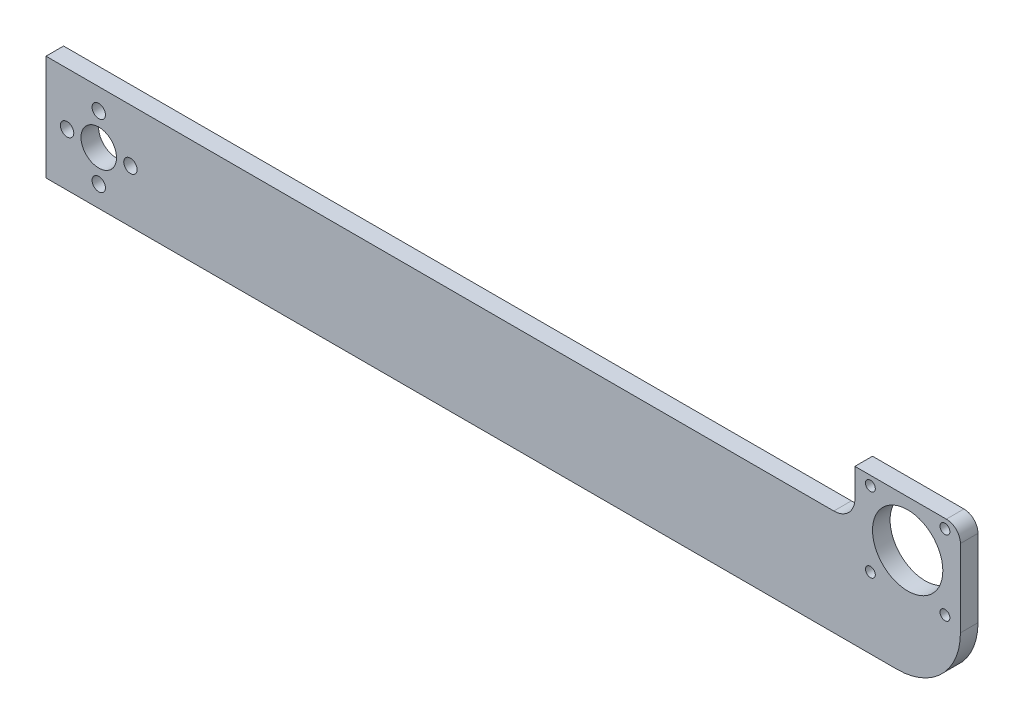
ISO-10303-21;
HEADER;
FILE_DESCRIPTION(('STEP AP214'),'2;1');
FILE_NAME('part.step','',(''),(''),'','','');
FILE_SCHEMA(('AUTOMOTIVE_DESIGN { 1 0 10303 214 1 1 1 1 }'));
ENDSEC;
DATA;
#1=APPLICATION_CONTEXT('core data for automotive mechanical design processes');
#2=APPLICATION_PROTOCOL_DEFINITION('international standard','automotive_design',2000,#1);
#3=PRODUCT_CONTEXT('',#1,'mechanical');
#4=PRODUCT('Part','Part','',(#3));
#5=PRODUCT_RELATED_PRODUCT_CATEGORY('part','',(#4));
#6=PRODUCT_DEFINITION_FORMATION('','',#4);
#7=PRODUCT_DEFINITION_CONTEXT('part definition',#1,'design');
#8=PRODUCT_DEFINITION('design','',#6,#7);
#9=PRODUCT_DEFINITION_SHAPE('','',#8);
#10=(LENGTH_UNIT() NAMED_UNIT(*) SI_UNIT(.MILLI.,.METRE.));
#11=(NAMED_UNIT(*) PLANE_ANGLE_UNIT() SI_UNIT($,.RADIAN.));
#12=(NAMED_UNIT(*) SI_UNIT($,.STERADIAN.) SOLID_ANGLE_UNIT());
#13=UNCERTAINTY_MEASURE_WITH_UNIT(LENGTH_MEASURE(1.E-05),#10,'distance_accuracy_value','');
#14=(GEOMETRIC_REPRESENTATION_CONTEXT(3) GLOBAL_UNCERTAINTY_ASSIGNED_CONTEXT((#13)) GLOBAL_UNIT_ASSIGNED_CONTEXT((#10,
#11,#12)) REPRESENTATION_CONTEXT('',''));
#15=CARTESIAN_POINT('',(0.,0.,0.));
#16=DIRECTION('',(0.,0.,1.));
#17=DIRECTION('',(1.,0.,0.));
#18=AXIS2_PLACEMENT_3D('',#15,#16,#17);
#19=CARTESIAN_POINT('',(288.29,3.81000000000001,6.35));
#20=DIRECTION('',(0.,0.,1.));
#21=DIRECTION('',(1.,0.,0.));
#22=AXIS2_PLACEMENT_3D('',#19,#20,#21);
#23=PLANE('',#22);
#24=CARTESIAN_POINT('',(305.562,6.58723685199558,6.35));
#25=DIRECTION('',(0.,0.,1.));
#26=DIRECTION('',(1.,0.,0.));
#27=AXIS2_PLACEMENT_3D('',#24,#25,#26);
#28=CIRCLE('',#27,1.77799999999998);
#29=CARTESIAN_POINT('',(307.34,6.58723685199558,6.35));
#30=VERTEX_POINT('',#29);
#31=EDGE_CURVE('E222',#30,#30,#28,.T.);
#32=ORIENTED_EDGE('',*,*,#31,.F.);
#33=EDGE_LOOP('',(#32));
#34=FACE_BOUND('',#33,.T.);
#35=CARTESIAN_POINT('',(278.638,33.5447631480043,6.35));
#36=DIRECTION('',(0.,0.,1.));
#37=DIRECTION('',(1.,0.,0.));
#38=AXIS2_PLACEMENT_3D('',#35,#36,#37);
#39=CIRCLE('',#38,1.77799999999998);
#40=CARTESIAN_POINT('',(280.416,33.5447631480043,6.35));
#41=VERTEX_POINT('',#40);
#42=EDGE_CURVE('E210',#41,#41,#39,.T.);
#43=ORIENTED_EDGE('',*,*,#42,.F.);
#44=EDGE_LOOP('',(#43));
#45=FACE_BOUND('',#44,.T.);
#46=CARTESIAN_POINT('',(-11.4299999999997,-3.24160253143805E-13,6.35));
#47=DIRECTION('',(0.,0.,1.));
#48=DIRECTION('',(1.,0.,0.));
#49=AXIS2_PLACEMENT_3D('',#46,#47,#48);
#50=CIRCLE('',#49,2.413);
#51=CARTESIAN_POINT('',(-9.01699999999968,-3.24160253143805E-13,6.35));
#52=VERTEX_POINT('',#51);
#53=EDGE_CURVE('E198',#52,#52,#50,.T.);
#54=ORIENTED_EDGE('',*,*,#53,.F.);
#55=EDGE_LOOP('',(#54));
#56=FACE_BOUND('',#55,.T.);
#57=CARTESIAN_POINT('',(11.4300000000003,3.2276048185238E-13,6.35));
#58=DIRECTION('',(0.,0.,1.));
#59=DIRECTION('',(1.,0.,0.));
#60=AXIS2_PLACEMENT_3D('',#57,#58,#59);
#61=CIRCLE('',#60,2.413);
#62=CARTESIAN_POINT('',(13.8430000000003,3.2276048185238E-13,6.35));
#63=VERTEX_POINT('',#62);
#64=EDGE_CURVE('E186',#63,#63,#61,.T.);
#65=ORIENTED_EDGE('',*,*,#64,.F.);
#66=EDGE_LOOP('',(#65));
#67=FACE_BOUND('',#66,.T.);
#68=CARTESIAN_POINT('',(0.,0.,6.35));
#69=DIRECTION('',(0.,0.,1.));
#70=DIRECTION('',(1.,0.,0.));
#71=AXIS2_PLACEMENT_3D('',#68,#69,#70);
#72=CIRCLE('',#71,6.4135);
#73=CARTESIAN_POINT('',(6.4135,0.,6.35));
#74=VERTEX_POINT('',#73);
#75=EDGE_CURVE('E166',#74,#74,#72,.T.);
#76=ORIENTED_EDGE('',*,*,#75,.F.);
#77=EDGE_LOOP('',(#76));
#78=FACE_BOUND('',#77,.T.);
#79=DIRECTION('',(0.,1.,0.));
#80=VECTOR('',#79,1.);
#81=CARTESIAN_POINT('',(311.15,3.81000000000001,6.35));
#82=LINE('',#81,#80);
#83=CARTESIAN_POINT('',(311.15,3.81000000000001,6.35));
#84=VERTEX_POINT('',#83);
#85=CARTESIAN_POINT('',(311.15,31.75,6.35));
#86=VERTEX_POINT('',#85);
#87=EDGE_CURVE('E174',#84,#86,#82,.T.);
#88=ORIENTED_EDGE('',*,*,#87,.T.);
#89=CARTESIAN_POINT('',(306.07,31.75,6.35));
#90=DIRECTION('',(0.,0.,1.));
#91=DIRECTION('',(1.,0.,0.));
#92=AXIS2_PLACEMENT_3D('',#89,#90,#91);
#93=CIRCLE('',#92,5.08);
#94=CARTESIAN_POINT('',(306.07,36.83,6.35));
#95=VERTEX_POINT('',#94);
#96=EDGE_CURVE('E11',#86,#95,#93,.T.);
#97=ORIENTED_EDGE('',*,*,#96,.T.);
#98=DIRECTION('',(-1.,0.,0.));
#99=VECTOR('',#98,1.);
#100=CARTESIAN_POINT('',(273.05,36.83,6.35));
#101=LINE('',#100,#99);
#102=CARTESIAN_POINT('',(273.05,36.83,6.35));
#103=VERTEX_POINT('',#102);
#104=EDGE_CURVE('E172',#95,#103,#101,.T.);
#105=ORIENTED_EDGE('',*,*,#104,.T.);
#106=DIRECTION('',(0.,-1.,0.));
#107=VECTOR('',#106,1.);
#108=CARTESIAN_POINT('',(273.05,36.83,6.35));
#109=LINE('',#108,#107);
#110=CARTESIAN_POINT('',(273.05,26.67,6.35));
#111=VERTEX_POINT('',#110);
#112=EDGE_CURVE('E170',#103,#111,#109,.T.);
#113=ORIENTED_EDGE('',*,*,#112,.T.);
#114=CARTESIAN_POINT('',(265.43,26.67,6.35));
#115=DIRECTION('',(0.,0.,-1.));
#116=DIRECTION('',(1.,0.,0.));
#117=AXIS2_PLACEMENT_3D('',#114,#115,#116);
#118=CIRCLE('',#117,7.62000000000001);
#119=CARTESIAN_POINT('',(265.43,19.05,6.35));
#120=VERTEX_POINT('',#119);
#121=EDGE_CURVE('E168',#111,#120,#118,.T.);
#122=ORIENTED_EDGE('',*,*,#121,.T.);
#123=DIRECTION('',(-1.,0.,0.));
#124=VECTOR('',#123,1.);
#125=CARTESIAN_POINT('',(-19.05,19.05,6.35));
#126=LINE('',#125,#124);
#127=CARTESIAN_POINT('',(-19.05,19.05,6.35));
#128=VERTEX_POINT('',#127);
#129=EDGE_CURVE('E122',#120,#128,#126,.T.);
#130=ORIENTED_EDGE('',*,*,#129,.T.);
#131=DIRECTION('',(0.,-1.,0.));
#132=VECTOR('',#131,1.);
#133=CARTESIAN_POINT('',(-19.05,19.05,6.35));
#134=LINE('',#133,#132);
#135=CARTESIAN_POINT('',(-19.05,-19.05,6.35));
#136=VERTEX_POINT('',#135);
#137=EDGE_CURVE('E117',#128,#136,#134,.T.);
#138=ORIENTED_EDGE('',*,*,#137,.T.);
#139=DIRECTION('',(1.,0.,0.));
#140=VECTOR('',#139,1.);
#141=CARTESIAN_POINT('',(-19.05,-19.05,6.35));
#142=LINE('',#141,#140);
#143=CARTESIAN_POINT('',(288.29,-19.05,6.35));
#144=VERTEX_POINT('',#143);
#145=EDGE_CURVE('E106',#136,#144,#142,.T.);
#146=ORIENTED_EDGE('',*,*,#145,.T.);
#147=CARTESIAN_POINT('',(288.29,3.81000000000001,6.35));
#148=DIRECTION('',(0.,0.,1.));
#149=DIRECTION('',(1.,0.,0.));
#150=AXIS2_PLACEMENT_3D('',#147,#148,#149);
#151=CIRCLE('',#150,22.86);
#152=EDGE_CURVE('E116',#144,#84,#151,.T.);
#153=ORIENTED_EDGE('',*,*,#152,.T.);
#154=EDGE_LOOP('',(#88,#97,#105,#113,#122,#130,#138,#146,#153));
#155=FACE_BOUND('',#154,.T.);
#156=CARTESIAN_POINT('',(0.,11.43,6.35));
#157=DIRECTION('',(0.,0.,1.));
#158=DIRECTION('',(1.,0.,0.));
#159=AXIS2_PLACEMENT_3D('',#156,#157,#158);
#160=CIRCLE('',#159,2.413);
#161=CARTESIAN_POINT('',(2.413,11.43,6.35));
#162=VERTEX_POINT('',#161);
#163=EDGE_CURVE('E180',#162,#162,#160,.T.);
#164=ORIENTED_EDGE('',*,*,#163,.F.);
#165=EDGE_LOOP('',(#164));
#166=FACE_BOUND('',#165,.T.);
#167=CARTESIAN_POINT('',(6.45520963704759E-13,-11.43,6.35));
#168=DIRECTION('',(0.,0.,1.));
#169=DIRECTION('',(1.,0.,0.));
#170=AXIS2_PLACEMENT_3D('',#167,#168,#169);
#171=CIRCLE('',#170,2.413);
#172=CARTESIAN_POINT('',(2.41300000000065,-11.43,6.35));
#173=VERTEX_POINT('',#172);
#174=EDGE_CURVE('E192',#173,#173,#171,.T.);
#175=ORIENTED_EDGE('',*,*,#174,.F.);
#176=EDGE_LOOP('',(#175));
#177=FACE_BOUND('',#176,.T.);
#178=CARTESIAN_POINT('',(292.1,20.066,6.35));
#179=DIRECTION('',(0.,0.,1.));
#180=DIRECTION('',(1.,0.,0.));
#181=AXIS2_PLACEMENT_3D('',#178,#179,#180);
#182=CIRCLE('',#181,12.7);
#183=CARTESIAN_POINT('',(304.8,20.066,6.35));
#184=VERTEX_POINT('',#183);
#185=EDGE_CURVE('E204',#184,#184,#182,.T.);
#186=ORIENTED_EDGE('',*,*,#185,.F.);
#187=EDGE_LOOP('',(#186));
#188=FACE_BOUND('',#187,.T.);
#189=CARTESIAN_POINT('',(305.562,33.5447631480043,6.35));
#190=DIRECTION('',(0.,0.,1.));
#191=DIRECTION('',(1.,0.,0.));
#192=AXIS2_PLACEMENT_3D('',#189,#190,#191);
#193=CIRCLE('',#192,1.77799999999998);
#194=CARTESIAN_POINT('',(307.34,33.5447631480043,6.35));
#195=VERTEX_POINT('',#194);
#196=EDGE_CURVE('E216',#195,#195,#193,.T.);
#197=ORIENTED_EDGE('',*,*,#196,.F.);
#198=EDGE_LOOP('',(#197));
#199=FACE_BOUND('',#198,.T.);
#200=CARTESIAN_POINT('',(278.638,6.58723685199558,6.35));
#201=DIRECTION('',(0.,0.,1.));
#202=DIRECTION('',(1.,0.,0.));
#203=AXIS2_PLACEMENT_3D('',#200,#201,#202);
#204=CIRCLE('',#203,1.77799999999998);
#205=CARTESIAN_POINT('',(280.416,6.58723685199558,6.35));
#206=VERTEX_POINT('',#205);
#207=EDGE_CURVE('E228',#206,#206,#204,.T.);
#208=ORIENTED_EDGE('',*,*,#207,.F.);
#209=EDGE_LOOP('',(#208));
#210=FACE_BOUND('',#209,.T.);
#211=ADVANCED_FACE('F35',(#34,#45,#56,#67,#78,#155,#166,#177,#188,#199,#210),#23,.T.);
#212=CARTESIAN_POINT('',(288.29,3.81000000000001,0.));
#213=DIRECTION('',(0.,0.,1.));
#214=DIRECTION('',(1.,0.,0.));
#215=AXIS2_PLACEMENT_3D('',#212,#213,#214);
#216=PLANE('',#215);
#217=DIRECTION('',(-1.,0.,0.));
#218=VECTOR('',#217,1.);
#219=CARTESIAN_POINT('',(273.05,36.83,0.));
#220=LINE('',#219,#218);
#221=CARTESIAN_POINT('',(306.07,36.83,0.));
#222=VERTEX_POINT('',#221);
#223=CARTESIAN_POINT('',(273.05,36.83,0.));
#224=VERTEX_POINT('',#223);
#225=EDGE_CURVE('E157',#222,#224,#220,.T.);
#226=ORIENTED_EDGE('',*,*,#225,.F.);
#227=CARTESIAN_POINT('',(306.07,31.75,0.));
#228=DIRECTION('',(0.,0.,1.));
#229=DIRECTION('',(1.,0.,0.));
#230=AXIS2_PLACEMENT_3D('',#227,#228,#229);
#231=CIRCLE('',#230,5.08);
#232=CARTESIAN_POINT('',(311.15,31.75,0.));
#233=VERTEX_POINT('',#232);
#234=EDGE_CURVE('E57',#222,#233,#231,.F.);
#235=ORIENTED_EDGE('',*,*,#234,.T.);
#236=DIRECTION('',(0.,1.,0.));
#237=VECTOR('',#236,1.);
#238=CARTESIAN_POINT('',(311.15,3.81000000000001,0.));
#239=LINE('',#238,#237);
#240=CARTESIAN_POINT('',(311.15,3.81000000000001,0.));
#241=VERTEX_POINT('',#240);
#242=EDGE_CURVE('E159',#241,#233,#239,.T.);
#243=ORIENTED_EDGE('',*,*,#242,.F.);
#244=CARTESIAN_POINT('',(288.29,3.81000000000001,0.));
#245=DIRECTION('',(0.,0.,1.));
#246=DIRECTION('',(1.,0.,0.));
#247=AXIS2_PLACEMENT_3D('',#244,#245,#246);
#248=CIRCLE('',#247,22.86);
#249=CARTESIAN_POINT('',(288.29,-19.05,0.));
#250=VERTEX_POINT('',#249);
#251=EDGE_CURVE('E161',#250,#241,#248,.T.);
#252=ORIENTED_EDGE('',*,*,#251,.F.);
#253=DIRECTION('',(1.,0.,0.));
#254=VECTOR('',#253,1.);
#255=CARTESIAN_POINT('',(286.189260549362,-19.05,0.));
#256=LINE('',#255,#254);
#257=CARTESIAN_POINT('',(-19.05,-19.05,0.));
#258=VERTEX_POINT('',#257);
#259=EDGE_CURVE('E163',#258,#250,#256,.T.);
#260=ORIENTED_EDGE('',*,*,#259,.F.);
#261=DIRECTION('',(0.,-1.,0.));
#262=VECTOR('',#261,1.);
#263=CARTESIAN_POINT('',(-19.05,19.05,0.));
#264=LINE('',#263,#262);
#265=CARTESIAN_POINT('',(-19.05,19.05,0.));
#266=VERTEX_POINT('',#265);
#267=EDGE_CURVE('E130',#266,#258,#264,.T.);
#268=ORIENTED_EDGE('',*,*,#267,.F.);
#269=DIRECTION('',(-1.,0.,0.));
#270=VECTOR('',#269,1.);
#271=CARTESIAN_POINT('',(-19.05,19.05,0.));
#272=LINE('',#271,#270);
#273=CARTESIAN_POINT('',(265.43,19.05,0.));
#274=VERTEX_POINT('',#273);
#275=EDGE_CURVE('E126',#274,#266,#272,.T.);
#276=ORIENTED_EDGE('',*,*,#275,.F.);
#277=CARTESIAN_POINT('',(265.43,26.67,0.));
#278=DIRECTION('',(0.,0.,-1.));
#279=DIRECTION('',(1.,0.,0.));
#280=AXIS2_PLACEMENT_3D('',#277,#278,#279);
#281=CIRCLE('',#280,7.62000000000001);
#282=CARTESIAN_POINT('',(273.05,26.67,0.));
#283=VERTEX_POINT('',#282);
#284=EDGE_CURVE('E153',#283,#274,#281,.T.);
#285=ORIENTED_EDGE('',*,*,#284,.F.);
#286=DIRECTION('',(0.,-1.,0.));
#287=VECTOR('',#286,1.);
#288=CARTESIAN_POINT('',(273.05,36.83,0.));
#289=LINE('',#288,#287);
#290=EDGE_CURVE('E155',#224,#283,#289,.T.);
#291=ORIENTED_EDGE('',*,*,#290,.F.);
#292=EDGE_LOOP('',(#226,#235,#243,#252,#260,#268,#276,#285,#291));
#293=FACE_BOUND('',#292,.T.);
#294=CARTESIAN_POINT('',(0.,0.,0.));
#295=DIRECTION('',(0.,0.,1.));
#296=DIRECTION('',(1.,0.,0.));
#297=AXIS2_PLACEMENT_3D('',#294,#295,#296);
#298=CIRCLE('',#297,6.4135);
#299=CARTESIAN_POINT('',(6.4135,0.,0.));
#300=VERTEX_POINT('',#299);
#301=EDGE_CURVE('E177',#300,#300,#298,.T.);
#302=ORIENTED_EDGE('',*,*,#301,.T.);
#303=EDGE_LOOP('',(#302));
#304=FACE_BOUND('',#303,.T.);
#305=CARTESIAN_POINT('',(0.,11.43,0.));
#306=DIRECTION('',(0.,0.,1.));
#307=DIRECTION('',(1.,0.,0.));
#308=AXIS2_PLACEMENT_3D('',#305,#306,#307);
#309=CIRCLE('',#308,2.413);
#310=CARTESIAN_POINT('',(2.413,11.43,0.));
#311=VERTEX_POINT('',#310);
#312=EDGE_CURVE('E183',#311,#311,#309,.T.);
#313=ORIENTED_EDGE('',*,*,#312,.T.);
#314=EDGE_LOOP('',(#313));
#315=FACE_BOUND('',#314,.T.);
#316=CARTESIAN_POINT('',(11.4300000000003,3.2276048185238E-13,0.));
#317=DIRECTION('',(0.,0.,1.));
#318=DIRECTION('',(1.,0.,0.));
#319=AXIS2_PLACEMENT_3D('',#316,#317,#318);
#320=CIRCLE('',#319,2.413);
#321=CARTESIAN_POINT('',(13.8430000000003,3.2276048185238E-13,0.));
#322=VERTEX_POINT('',#321);
#323=EDGE_CURVE('E189',#322,#322,#320,.T.);
#324=ORIENTED_EDGE('',*,*,#323,.T.);
#325=EDGE_LOOP('',(#324));
#326=FACE_BOUND('',#325,.T.);
#327=CARTESIAN_POINT('',(6.45520963704759E-13,-11.43,0.));
#328=DIRECTION('',(0.,0.,1.));
#329=DIRECTION('',(1.,0.,0.));
#330=AXIS2_PLACEMENT_3D('',#327,#328,#329);
#331=CIRCLE('',#330,2.413);
#332=CARTESIAN_POINT('',(2.41300000000065,-11.43,0.));
#333=VERTEX_POINT('',#332);
#334=EDGE_CURVE('E195',#333,#333,#331,.T.);
#335=ORIENTED_EDGE('',*,*,#334,.T.);
#336=EDGE_LOOP('',(#335));
#337=FACE_BOUND('',#336,.T.);
#338=CARTESIAN_POINT('',(-11.4299999999997,-3.24160253143805E-13,0.));
#339=DIRECTION('',(0.,0.,1.));
#340=DIRECTION('',(1.,0.,0.));
#341=AXIS2_PLACEMENT_3D('',#338,#339,#340);
#342=CIRCLE('',#341,2.413);
#343=CARTESIAN_POINT('',(-9.01699999999968,-3.24160253143805E-13,0.));
#344=VERTEX_POINT('',#343);
#345=EDGE_CURVE('E201',#344,#344,#342,.T.);
#346=ORIENTED_EDGE('',*,*,#345,.T.);
#347=EDGE_LOOP('',(#346));
#348=FACE_BOUND('',#347,.T.);
#349=CARTESIAN_POINT('',(292.1,20.066,0.));
#350=DIRECTION('',(0.,0.,1.));
#351=DIRECTION('',(1.,0.,0.));
#352=AXIS2_PLACEMENT_3D('',#349,#350,#351);
#353=CIRCLE('',#352,12.7);
#354=CARTESIAN_POINT('',(304.8,20.066,0.));
#355=VERTEX_POINT('',#354);
#356=EDGE_CURVE('E207',#355,#355,#353,.T.);
#357=ORIENTED_EDGE('',*,*,#356,.T.);
#358=EDGE_LOOP('',(#357));
#359=FACE_BOUND('',#358,.T.);
#360=CARTESIAN_POINT('',(278.638,33.5447631480043,0.));
#361=DIRECTION('',(0.,0.,1.));
#362=DIRECTION('',(1.,0.,0.));
#363=AXIS2_PLACEMENT_3D('',#360,#361,#362);
#364=CIRCLE('',#363,1.77799999999998);
#365=CARTESIAN_POINT('',(280.416,33.5447631480043,0.));
#366=VERTEX_POINT('',#365);
#367=EDGE_CURVE('E213',#366,#366,#364,.T.);
#368=ORIENTED_EDGE('',*,*,#367,.T.);
#369=EDGE_LOOP('',(#368));
#370=FACE_BOUND('',#369,.T.);
#371=CARTESIAN_POINT('',(305.562,33.5447631480043,0.));
#372=DIRECTION('',(0.,0.,1.));
#373=DIRECTION('',(1.,0.,0.));
#374=AXIS2_PLACEMENT_3D('',#371,#372,#373);
#375=CIRCLE('',#374,1.77799999999998);
#376=CARTESIAN_POINT('',(307.34,33.5447631480043,0.));
#377=VERTEX_POINT('',#376);
#378=EDGE_CURVE('E219',#377,#377,#375,.T.);
#379=ORIENTED_EDGE('',*,*,#378,.T.);
#380=EDGE_LOOP('',(#379));
#381=FACE_BOUND('',#380,.T.);
#382=CARTESIAN_POINT('',(305.562,6.58723685199558,0.));
#383=DIRECTION('',(0.,0.,1.));
#384=DIRECTION('',(1.,0.,0.));
#385=AXIS2_PLACEMENT_3D('',#382,#383,#384);
#386=CIRCLE('',#385,1.77799999999998);
#387=CARTESIAN_POINT('',(307.34,6.58723685199558,0.));
#388=VERTEX_POINT('',#387);
#389=EDGE_CURVE('E225',#388,#388,#386,.T.);
#390=ORIENTED_EDGE('',*,*,#389,.T.);
#391=EDGE_LOOP('',(#390));
#392=FACE_BOUND('',#391,.T.);
#393=CARTESIAN_POINT('',(278.638,6.58723685199558,0.));
#394=DIRECTION('',(0.,0.,1.));
#395=DIRECTION('',(1.,0.,0.));
#396=AXIS2_PLACEMENT_3D('',#393,#394,#395);
#397=CIRCLE('',#396,1.77799999999998);
#398=CARTESIAN_POINT('',(280.416,6.58723685199558,0.));
#399=VERTEX_POINT('',#398);
#400=EDGE_CURVE('E231',#399,#399,#397,.T.);
#401=ORIENTED_EDGE('',*,*,#400,.T.);
#402=EDGE_LOOP('',(#401));
#403=FACE_BOUND('',#402,.T.);
#404=ADVANCED_FACE('F241',(#293,#304,#315,#326,#337,#348,#359,#370,#381,#392,#403),#216,.F.);
#405=CARTESIAN_POINT('',(-19.05,19.05,6.35));
#406=DIRECTION('',(1.,0.,0.));
#407=DIRECTION('',(0.,0.,-1.));
#408=AXIS2_PLACEMENT_3D('',#405,#406,#407);
#409=PLANE('',#408);
#410=ORIENTED_EDGE('',*,*,#267,.T.);
#411=DIRECTION('',(0.,0.,-1.));
#412=VECTOR('',#411,1.);
#413=CARTESIAN_POINT('',(-19.05,-19.05,6.35));
#414=LINE('',#413,#412);
#415=EDGE_CURVE('E110',#136,#258,#414,.T.);
#416=ORIENTED_EDGE('',*,*,#415,.F.);
#417=ORIENTED_EDGE('',*,*,#137,.F.);
#418=DIRECTION('',(0.,0.,-1.));
#419=VECTOR('',#418,1.);
#420=CARTESIAN_POINT('',(-19.05,19.05,6.35));
#421=LINE('',#420,#419);
#422=EDGE_CURVE('E150',#128,#266,#421,.T.);
#423=ORIENTED_EDGE('',*,*,#422,.T.);
#424=EDGE_LOOP('',(#410,#416,#417,#423));
#425=FACE_BOUND('',#424,.T.);
#426=ADVANCED_FACE('F128',(#425),#409,.F.);
#427=CARTESIAN_POINT('',(286.189260549362,-19.05,6.35));
#428=DIRECTION('',(0.,1.,0.));
#429=DIRECTION('',(0.,0.,1.));
#430=AXIS2_PLACEMENT_3D('',#427,#428,#429);
#431=PLANE('',#430);
#432=ORIENTED_EDGE('',*,*,#259,.T.);
#433=DIRECTION('',(0.,0.,-1.));
#434=VECTOR('',#433,1.);
#435=CARTESIAN_POINT('',(288.29,-19.05,6.35));
#436=LINE('',#435,#434);
#437=EDGE_CURVE('E113',#144,#250,#436,.T.);
#438=ORIENTED_EDGE('',*,*,#437,.F.);
#439=ORIENTED_EDGE('',*,*,#145,.F.);
#440=ORIENTED_EDGE('',*,*,#415,.T.);
#441=EDGE_LOOP('',(#432,#438,#439,#440));
#442=FACE_BOUND('',#441,.T.);
#443=ADVANCED_FACE('F108',(#442),#431,.F.);
#444=CARTESIAN_POINT('',(288.29,3.81000000000001,6.35));
#445=DIRECTION('',(0.,0.,-1.));
#446=DIRECTION('',(-1.,0.,0.));
#447=AXIS2_PLACEMENT_3D('',#444,#445,#446);
#448=CYLINDRICAL_SURFACE('',#447,22.86);
#449=ORIENTED_EDGE('',*,*,#251,.T.);
#450=DIRECTION('',(0.,0.,-1.));
#451=VECTOR('',#450,1.);
#452=CARTESIAN_POINT('',(311.15,3.81000000000001,6.35));
#453=LINE('',#452,#451);
#454=EDGE_CURVE('E135',#84,#241,#453,.T.);
#455=ORIENTED_EDGE('',*,*,#454,.F.);
#456=ORIENTED_EDGE('',*,*,#152,.F.);
#457=ORIENTED_EDGE('',*,*,#437,.T.);
#458=EDGE_LOOP('',(#449,#455,#456,#457));
#459=FACE_BOUND('',#458,.T.);
#460=ADVANCED_FACE('F273',(#459),#448,.T.);
#461=CARTESIAN_POINT('',(311.15,3.81000000000001,6.35));
#462=DIRECTION('',(-1.,0.,0.));
#463=DIRECTION('',(0.,0.,1.));
#464=AXIS2_PLACEMENT_3D('',#461,#462,#463);
#465=PLANE('',#464);
#466=ORIENTED_EDGE('',*,*,#242,.T.);
#467=DIRECTION('',(0.,0.,-1.));
#468=VECTOR('',#467,1.);
#469=CARTESIAN_POINT('',(311.15,31.75,6.35));
#470=LINE('',#469,#468);
#471=EDGE_CURVE('E43',#233,#86,#470,.F.);
#472=ORIENTED_EDGE('',*,*,#471,.T.);
#473=ORIENTED_EDGE('',*,*,#87,.F.);
#474=ORIENTED_EDGE('',*,*,#454,.T.);
#475=EDGE_LOOP('',(#466,#472,#473,#474));
#476=FACE_BOUND('',#475,.T.);
#477=ADVANCED_FACE('F269',(#476),#465,.F.);
#478=CARTESIAN_POINT('',(273.05,36.83,6.35));
#479=DIRECTION('',(0.,-1.,0.));
#480=DIRECTION('',(1.,0.,0.));
#481=AXIS2_PLACEMENT_3D('',#478,#479,#480);
#482=PLANE('',#481);
#483=ORIENTED_EDGE('',*,*,#104,.F.);
#484=DIRECTION('',(0.,0.,-1.));
#485=VECTOR('',#484,1.);
#486=CARTESIAN_POINT('',(306.07,36.83,6.35));
#487=LINE('',#486,#485);
#488=EDGE_CURVE('E131',#95,#222,#487,.T.);
#489=ORIENTED_EDGE('',*,*,#488,.T.);
#490=ORIENTED_EDGE('',*,*,#225,.T.);
#491=DIRECTION('',(0.,0.,-1.));
#492=VECTOR('',#491,1.);
#493=CARTESIAN_POINT('',(273.05,36.83,6.35));
#494=LINE('',#493,#492);
#495=EDGE_CURVE('E141',#103,#224,#494,.T.);
#496=ORIENTED_EDGE('',*,*,#495,.F.);
#497=EDGE_LOOP('',(#483,#489,#490,#496));
#498=FACE_BOUND('',#497,.T.);
#499=ADVANCED_FACE('F265',(#498),#482,.F.);
#500=CARTESIAN_POINT('',(273.05,36.83,6.35));
#501=DIRECTION('',(1.,0.,0.));
#502=DIRECTION('',(0.,0.,-1.));
#503=AXIS2_PLACEMENT_3D('',#500,#501,#502);
#504=PLANE('',#503);
#505=ORIENTED_EDGE('',*,*,#290,.T.);
#506=DIRECTION('',(0.,0.,-1.));
#507=VECTOR('',#506,1.);
#508=CARTESIAN_POINT('',(273.05,26.67,6.35));
#509=LINE('',#508,#507);
#510=EDGE_CURVE('E144',#111,#283,#509,.T.);
#511=ORIENTED_EDGE('',*,*,#510,.F.);
#512=ORIENTED_EDGE('',*,*,#112,.F.);
#513=ORIENTED_EDGE('',*,*,#495,.T.);
#514=EDGE_LOOP('',(#505,#511,#512,#513));
#515=FACE_BOUND('',#514,.T.);
#516=ADVANCED_FACE('F261',(#515),#504,.F.);
#517=CARTESIAN_POINT('',(265.43,26.67,6.35));
#518=DIRECTION('',(0.,0.,-1.));
#519=DIRECTION('',(-1.,0.,0.));
#520=AXIS2_PLACEMENT_3D('',#517,#518,#519);
#521=CYLINDRICAL_SURFACE('',#520,7.62000000000001);
#522=ORIENTED_EDGE('',*,*,#284,.T.);
#523=DIRECTION('',(0.,0.,-1.));
#524=VECTOR('',#523,1.);
#525=CARTESIAN_POINT('',(265.43,19.05,6.35));
#526=LINE('',#525,#524);
#527=EDGE_CURVE('E147',#120,#274,#526,.T.);
#528=ORIENTED_EDGE('',*,*,#527,.F.);
#529=ORIENTED_EDGE('',*,*,#121,.F.);
#530=ORIENTED_EDGE('',*,*,#510,.T.);
#531=EDGE_LOOP('',(#522,#528,#529,#530));
#532=FACE_BOUND('',#531,.T.);
#533=ADVANCED_FACE('F257',(#532),#521,.F.);
#534=CARTESIAN_POINT('',(-19.05,19.05,6.35));
#535=DIRECTION('',(0.,-1.,0.));
#536=DIRECTION('',(1.,0.,0.));
#537=AXIS2_PLACEMENT_3D('',#534,#535,#536);
#538=PLANE('',#537);
#539=ORIENTED_EDGE('',*,*,#275,.T.);
#540=ORIENTED_EDGE('',*,*,#422,.F.);
#541=ORIENTED_EDGE('',*,*,#129,.F.);
#542=ORIENTED_EDGE('',*,*,#527,.T.);
#543=EDGE_LOOP('',(#539,#540,#541,#542));
#544=FACE_BOUND('',#543,.T.);
#545=ADVANCED_FACE('F254',(#544),#538,.F.);
#546=CARTESIAN_POINT('',(0.,0.,6.35));
#547=DIRECTION('',(0.,0.,-1.));
#548=DIRECTION('',(-1.,0.,0.));
#549=AXIS2_PLACEMENT_3D('',#546,#547,#548);
#550=CYLINDRICAL_SURFACE('',#549,6.4135);
#551=ORIENTED_EDGE('',*,*,#75,.T.);
#552=EDGE_LOOP('',(#551));
#553=FACE_BOUND('',#552,.T.);
#554=ORIENTED_EDGE('',*,*,#301,.F.);
#555=EDGE_LOOP('',(#554));
#556=FACE_BOUND('',#555,.T.);
#557=ADVANCED_FACE('F251',(#553,#556),#550,.F.);
#558=CARTESIAN_POINT('',(0.,11.43,6.35));
#559=DIRECTION('',(0.,0.,-1.));
#560=DIRECTION('',(-1.,0.,0.));
#561=AXIS2_PLACEMENT_3D('',#558,#559,#560);
#562=CYLINDRICAL_SURFACE('',#561,2.413);
#563=ORIENTED_EDGE('',*,*,#163,.T.);
#564=EDGE_LOOP('',(#563));
#565=FACE_BOUND('',#564,.T.);
#566=ORIENTED_EDGE('',*,*,#312,.F.);
#567=EDGE_LOOP('',(#566));
#568=FACE_BOUND('',#567,.T.);
#569=ADVANCED_FACE('F318',(#565,#568),#562,.F.);
#570=CARTESIAN_POINT('',(11.4300000000003,3.2276048185238E-13,6.35));
#571=DIRECTION('',(0.,0.,-1.));
#572=DIRECTION('',(-1.,0.,0.));
#573=AXIS2_PLACEMENT_3D('',#570,#571,#572);
#574=CYLINDRICAL_SURFACE('',#573,2.413);
#575=ORIENTED_EDGE('',*,*,#64,.T.);
#576=EDGE_LOOP('',(#575));
#577=FACE_BOUND('',#576,.T.);
#578=ORIENTED_EDGE('',*,*,#323,.F.);
#579=EDGE_LOOP('',(#578));
#580=FACE_BOUND('',#579,.T.);
#581=ADVANCED_FACE('F325',(#577,#580),#574,.F.);
#582=CARTESIAN_POINT('',(6.45520963704759E-13,-11.43,6.35));
#583=DIRECTION('',(0.,0.,-1.));
#584=DIRECTION('',(-1.,0.,0.));
#585=AXIS2_PLACEMENT_3D('',#582,#583,#584);
#586=CYLINDRICAL_SURFACE('',#585,2.413);
#587=ORIENTED_EDGE('',*,*,#174,.T.);
#588=EDGE_LOOP('',(#587));
#589=FACE_BOUND('',#588,.T.);
#590=ORIENTED_EDGE('',*,*,#334,.F.);
#591=EDGE_LOOP('',(#590));
#592=FACE_BOUND('',#591,.T.);
#593=ADVANCED_FACE('F332',(#589,#592),#586,.F.);
#594=CARTESIAN_POINT('',(-11.4299999999997,-3.24160253143805E-13,6.35));
#595=DIRECTION('',(0.,0.,-1.));
#596=DIRECTION('',(-1.,0.,0.));
#597=AXIS2_PLACEMENT_3D('',#594,#595,#596);
#598=CYLINDRICAL_SURFACE('',#597,2.413);
#599=ORIENTED_EDGE('',*,*,#53,.T.);
#600=EDGE_LOOP('',(#599));
#601=FACE_BOUND('',#600,.T.);
#602=ORIENTED_EDGE('',*,*,#345,.F.);
#603=EDGE_LOOP('',(#602));
#604=FACE_BOUND('',#603,.T.);
#605=ADVANCED_FACE('F340',(#601,#604),#598,.F.);
#606=CARTESIAN_POINT('',(292.1,20.066,6.35));
#607=DIRECTION('',(0.,0.,-1.));
#608=DIRECTION('',(-1.,0.,0.));
#609=AXIS2_PLACEMENT_3D('',#606,#607,#608);
#610=CYLINDRICAL_SURFACE('',#609,12.7);
#611=ORIENTED_EDGE('',*,*,#185,.T.);
#612=EDGE_LOOP('',(#611));
#613=FACE_BOUND('',#612,.T.);
#614=ORIENTED_EDGE('',*,*,#356,.F.);
#615=EDGE_LOOP('',(#614));
#616=FACE_BOUND('',#615,.T.);
#617=ADVANCED_FACE('F348',(#613,#616),#610,.F.);
#618=CARTESIAN_POINT('',(278.638,33.5447631480043,6.35));
#619=DIRECTION('',(0.,0.,-1.));
#620=DIRECTION('',(-1.,0.,0.));
#621=AXIS2_PLACEMENT_3D('',#618,#619,#620);
#622=CYLINDRICAL_SURFACE('',#621,1.77799999999998);
#623=ORIENTED_EDGE('',*,*,#42,.T.);
#624=EDGE_LOOP('',(#623));
#625=FACE_BOUND('',#624,.T.);
#626=ORIENTED_EDGE('',*,*,#367,.F.);
#627=EDGE_LOOP('',(#626));
#628=FACE_BOUND('',#627,.T.);
#629=ADVANCED_FACE('F356',(#625,#628),#622,.F.);
#630=CARTESIAN_POINT('',(305.562,33.5447631480043,6.35));
#631=DIRECTION('',(0.,0.,-1.));
#632=DIRECTION('',(-1.,0.,0.));
#633=AXIS2_PLACEMENT_3D('',#630,#631,#632);
#634=CYLINDRICAL_SURFACE('',#633,1.77799999999998);
#635=ORIENTED_EDGE('',*,*,#196,.T.);
#636=EDGE_LOOP('',(#635));
#637=FACE_BOUND('',#636,.T.);
#638=ORIENTED_EDGE('',*,*,#378,.F.);
#639=EDGE_LOOP('',(#638));
#640=FACE_BOUND('',#639,.T.);
#641=ADVANCED_FACE('F364',(#637,#640),#634,.F.);
#642=CARTESIAN_POINT('',(305.562,6.58723685199558,6.35));
#643=DIRECTION('',(0.,0.,-1.));
#644=DIRECTION('',(-1.,0.,0.));
#645=AXIS2_PLACEMENT_3D('',#642,#643,#644);
#646=CYLINDRICAL_SURFACE('',#645,1.77799999999998);
#647=ORIENTED_EDGE('',*,*,#31,.T.);
#648=EDGE_LOOP('',(#647));
#649=FACE_BOUND('',#648,.T.);
#650=ORIENTED_EDGE('',*,*,#389,.F.);
#651=EDGE_LOOP('',(#650));
#652=FACE_BOUND('',#651,.T.);
#653=ADVANCED_FACE('F372',(#649,#652),#646,.F.);
#654=CARTESIAN_POINT('',(278.638,6.58723685199558,6.35));
#655=DIRECTION('',(0.,0.,-1.));
#656=DIRECTION('',(-1.,0.,0.));
#657=AXIS2_PLACEMENT_3D('',#654,#655,#656);
#658=CYLINDRICAL_SURFACE('',#657,1.77799999999998);
#659=ORIENTED_EDGE('',*,*,#207,.T.);
#660=EDGE_LOOP('',(#659));
#661=FACE_BOUND('',#660,.T.);
#662=ORIENTED_EDGE('',*,*,#400,.F.);
#663=EDGE_LOOP('',(#662));
#664=FACE_BOUND('',#663,.T.);
#665=ADVANCED_FACE('F237',(#661,#664),#658,.F.);
#666=CARTESIAN_POINT('',(306.07,31.75,6.35));
#667=DIRECTION('',(0.,0.,-1.));
#668=DIRECTION('',(-1.,0.,0.));
#669=AXIS2_PLACEMENT_3D('',#666,#667,#668);
#670=CYLINDRICAL_SURFACE('',#669,5.08);
#671=ORIENTED_EDGE('',*,*,#96,.F.);
#672=ORIENTED_EDGE('',*,*,#471,.F.);
#673=ORIENTED_EDGE('',*,*,#234,.F.);
#674=ORIENTED_EDGE('',*,*,#488,.F.);
#675=EDGE_LOOP('',(#671,#672,#673,#674));
#676=FACE_BOUND('',#675,.T.);
#677=ADVANCED_FACE('F37',(#676),#670,.T.);
#678=CLOSED_SHELL('',(#211,#404,#426,#443,#460,#477,#499,#516,#533,#545,#557,#569,#581,#593,
#605,#617,#629,#641,#653,#665,#677));
#679=MANIFOLD_SOLID_BREP('B2',#678);
#680=ADVANCED_BREP_SHAPE_REPRESENTATION('',(#18,#679),#14);
#681=SHAPE_DEFINITION_REPRESENTATION(#9,#680);
ENDSEC;
END-ISO-10303-21;
